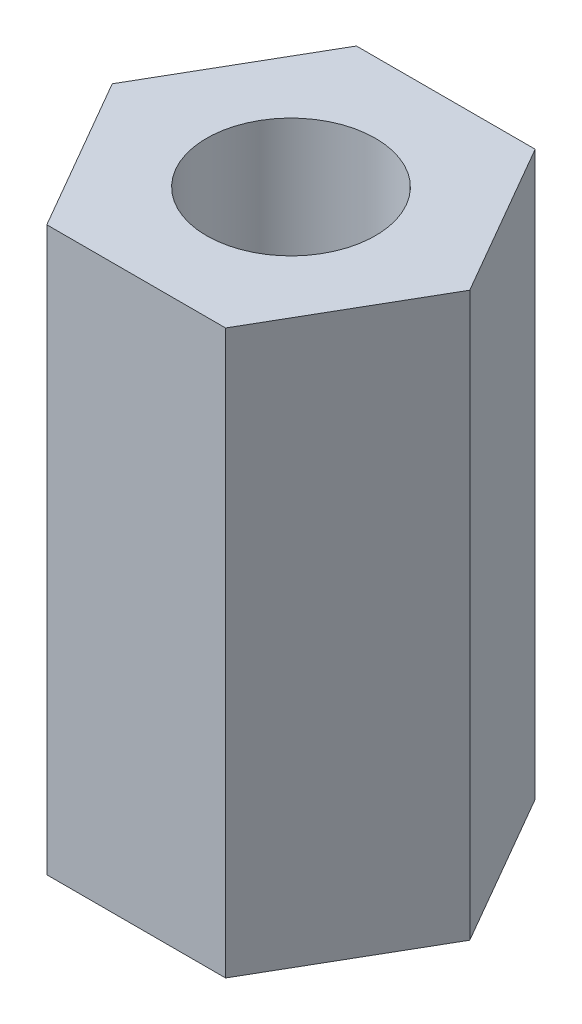
ISO-10303-21;
HEADER;
FILE_DESCRIPTION(('STEP AP214'),'2;1');
FILE_NAME('part.step','',(''),(''),'','','');
FILE_SCHEMA(('AUTOMOTIVE_DESIGN { 1 0 10303 214 1 1 1 1 }'));
ENDSEC;
DATA;
#1=APPLICATION_CONTEXT('core data for automotive mechanical design processes');
#2=APPLICATION_PROTOCOL_DEFINITION('international standard','automotive_design',2000,#1);
#3=PRODUCT_CONTEXT('',#1,'mechanical');
#4=PRODUCT('Part','Part','',(#3));
#5=PRODUCT_RELATED_PRODUCT_CATEGORY('part','',(#4));
#6=PRODUCT_DEFINITION_FORMATION('','',#4);
#7=PRODUCT_DEFINITION_CONTEXT('part definition',#1,'design');
#8=PRODUCT_DEFINITION('design','',#6,#7);
#9=PRODUCT_DEFINITION_SHAPE('','',#8);
#10=(LENGTH_UNIT() NAMED_UNIT(*) SI_UNIT(.MILLI.,.METRE.));
#11=(NAMED_UNIT(*) PLANE_ANGLE_UNIT() SI_UNIT($,.RADIAN.));
#12=(NAMED_UNIT(*) SI_UNIT($,.STERADIAN.) SOLID_ANGLE_UNIT());
#13=UNCERTAINTY_MEASURE_WITH_UNIT(LENGTH_MEASURE(1.E-05),#10,'distance_accuracy_value','');
#14=(GEOMETRIC_REPRESENTATION_CONTEXT(3) GLOBAL_UNCERTAINTY_ASSIGNED_CONTEXT((#13)) GLOBAL_UNIT_ASSIGNED_CONTEXT((#10,
#11,#12)) REPRESENTATION_CONTEXT('',''));
#15=CARTESIAN_POINT('',(0.,0.,0.));
#16=DIRECTION('',(0.,0.,1.));
#17=DIRECTION('',(1.,0.,0.));
#18=AXIS2_PLACEMENT_3D('',#15,#16,#17);
#19=CARTESIAN_POINT('',(0.,10.,0.));
#20=DIRECTION('',(0.,1.,0.));
#21=DIRECTION('',(0.,0.,1.));
#22=AXIS2_PLACEMENT_3D('',#19,#20,#21);
#23=PLANE('',#22);
#24=DIRECTION('',(0.499999999999995,0.,-0.866025403784441));
#25=VECTOR('',#24,1.);
#26=CARTESIAN_POINT('',(1.5877132402715,10.,2.74999999999997));
#27=LINE('',#26,#25);
#28=CARTESIAN_POINT('',(1.5877132402715,10.,2.74999999999997));
#29=VERTEX_POINT('',#28);
#30=CARTESIAN_POINT('',(3.17542648054293,10.,0.));
#31=VERTEX_POINT('',#30);
#32=EDGE_CURVE('E146',#29,#31,#27,.T.);
#33=ORIENTED_EDGE('',*,*,#32,.T.);
#34=DIRECTION('',(-0.500000000000001,0.,-0.866025403784438));
#35=VECTOR('',#34,1.);
#36=CARTESIAN_POINT('',(3.17542648054293,10.,0.));
#37=LINE('',#36,#35);
#38=CARTESIAN_POINT('',(1.58771324027146,10.,-2.74999999999999));
#39=VERTEX_POINT('',#38);
#40=EDGE_CURVE('E94',#31,#39,#37,.T.);
#41=ORIENTED_EDGE('',*,*,#40,.T.);
#42=DIRECTION('',(-1.,0.,0.));
#43=VECTOR('',#42,1.);
#44=CARTESIAN_POINT('',(1.58771324027146,10.,-2.74999999999999));
#45=LINE('',#44,#43);
#46=CARTESIAN_POINT('',(-1.58771324027148,10.,-2.74999999999998));
#47=VERTEX_POINT('',#46);
#48=EDGE_CURVE('E107',#39,#47,#45,.T.);
#49=ORIENTED_EDGE('',*,*,#48,.T.);
#50=DIRECTION('',(-0.499999999999995,0.,0.866025403784442));
#51=VECTOR('',#50,1.);
#52=CARTESIAN_POINT('',(-1.58771324027148,10.,-2.74999999999998));
#53=LINE('',#52,#51);
#54=CARTESIAN_POINT('',(-3.17542648054293,10.,0.));
#55=VERTEX_POINT('',#54);
#56=EDGE_CURVE('E101',#47,#55,#53,.T.);
#57=ORIENTED_EDGE('',*,*,#56,.T.);
#58=DIRECTION('',(0.500000000000007,0.,0.866025403784435));
#59=VECTOR('',#58,1.);
#60=CARTESIAN_POINT('',(-3.17542648054293,10.,0.));
#61=LINE('',#60,#59);
#62=CARTESIAN_POINT('',(-1.58771324027144,10.,2.75));
#63=VERTEX_POINT('',#62);
#64=EDGE_CURVE('E105',#55,#63,#61,.T.);
#65=ORIENTED_EDGE('',*,*,#64,.T.);
#66=DIRECTION('',(1.,0.,0.));
#67=VECTOR('',#66,1.);
#68=CARTESIAN_POINT('',(-1.58771324027144,10.,2.75));
#69=LINE('',#68,#67);
#70=EDGE_CURVE('E57',#63,#29,#69,.T.);
#71=ORIENTED_EDGE('',*,*,#70,.T.);
#72=EDGE_LOOP('',(#33,#41,#49,#57,#65,#71));
#73=FACE_BOUND('',#72,.T.);
#74=CARTESIAN_POINT('',(0.,10.,0.));
#75=DIRECTION('',(0.,1.,0.));
#76=DIRECTION('',(0.,0.,1.));
#77=AXIS2_PLACEMENT_3D('',#74,#75,#76);
#78=CIRCLE('',#77,1.5);
#79=CARTESIAN_POINT('',(0.,10.,1.5));
#80=VERTEX_POINT('',#79);
#81=EDGE_CURVE('E134',#80,#80,#78,.T.);
#82=ORIENTED_EDGE('',*,*,#81,.F.);
#83=EDGE_LOOP('',(#82));
#84=FACE_BOUND('',#83,.T.);
#85=ADVANCED_FACE('F39',(#73,#84),#23,.T.);
#86=CARTESIAN_POINT('',(0.,0.,0.));
#87=DIRECTION('',(0.,1.,0.));
#88=DIRECTION('',(0.,0.,1.));
#89=AXIS2_PLACEMENT_3D('',#86,#87,#88);
#90=PLANE('',#89);
#91=DIRECTION('',(0.499999999999995,0.,-0.866025403784441));
#92=VECTOR('',#91,1.);
#93=CARTESIAN_POINT('',(1.5877132402715,0.,2.74999999999997));
#94=LINE('',#93,#92);
#95=CARTESIAN_POINT('',(1.5877132402715,0.,2.74999999999997));
#96=VERTEX_POINT('',#95);
#97=CARTESIAN_POINT('',(3.17542648054293,0.,0.));
#98=VERTEX_POINT('',#97);
#99=EDGE_CURVE('E129',#96,#98,#94,.T.);
#100=ORIENTED_EDGE('',*,*,#99,.F.);
#101=DIRECTION('',(1.,0.,0.));
#102=VECTOR('',#101,1.);
#103=CARTESIAN_POINT('',(-1.58771324027144,0.,2.75));
#104=LINE('',#103,#102);
#105=CARTESIAN_POINT('',(-1.58771324027144,0.,2.75));
#106=VERTEX_POINT('',#105);
#107=EDGE_CURVE('E86',#106,#96,#104,.T.);
#108=ORIENTED_EDGE('',*,*,#107,.F.);
#109=DIRECTION('',(0.500000000000007,0.,0.866025403784435));
#110=VECTOR('',#109,1.);
#111=CARTESIAN_POINT('',(-3.17542648054293,0.,0.));
#112=LINE('',#111,#110);
#113=CARTESIAN_POINT('',(-3.17542648054293,0.,0.));
#114=VERTEX_POINT('',#113);
#115=EDGE_CURVE('E80',#114,#106,#112,.T.);
#116=ORIENTED_EDGE('',*,*,#115,.F.);
#117=DIRECTION('',(-0.499999999999995,0.,0.866025403784442));
#118=VECTOR('',#117,1.);
#119=CARTESIAN_POINT('',(-1.58771324027148,0.,-2.74999999999998));
#120=LINE('',#119,#118);
#121=CARTESIAN_POINT('',(-1.58771324027148,0.,-2.74999999999998));
#122=VERTEX_POINT('',#121);
#123=EDGE_CURVE('E116',#122,#114,#120,.T.);
#124=ORIENTED_EDGE('',*,*,#123,.F.);
#125=DIRECTION('',(-1.,0.,0.));
#126=VECTOR('',#125,1.);
#127=CARTESIAN_POINT('',(1.58771324027146,0.,-2.74999999999999));
#128=LINE('',#127,#126);
#129=CARTESIAN_POINT('',(1.58771324027146,0.,-2.74999999999999));
#130=VERTEX_POINT('',#129);
#131=EDGE_CURVE('E137',#130,#122,#128,.T.);
#132=ORIENTED_EDGE('',*,*,#131,.F.);
#133=DIRECTION('',(-0.500000000000001,0.,-0.866025403784438));
#134=VECTOR('',#133,1.);
#135=CARTESIAN_POINT('',(3.17542648054293,0.,0.));
#136=LINE('',#135,#134);
#137=EDGE_CURVE('E133',#98,#130,#136,.T.);
#138=ORIENTED_EDGE('',*,*,#137,.F.);
#139=EDGE_LOOP('',(#100,#108,#116,#124,#132,#138));
#140=FACE_BOUND('',#139,.T.);
#141=CARTESIAN_POINT('',(0.,0.,0.));
#142=DIRECTION('',(0.,1.,0.));
#143=DIRECTION('',(0.,0.,1.));
#144=AXIS2_PLACEMENT_3D('',#141,#142,#143);
#145=CIRCLE('',#144,1.5);
#146=CARTESIAN_POINT('',(0.,0.,1.5));
#147=VERTEX_POINT('',#146);
#148=EDGE_CURVE('E243',#147,#147,#145,.T.);
#149=ORIENTED_EDGE('',*,*,#148,.T.);
#150=EDGE_LOOP('',(#149));
#151=FACE_BOUND('',#150,.T.);
#152=ADVANCED_FACE('F159',(#140,#151),#90,.F.);
#153=CARTESIAN_POINT('',(1.5877132402715,10.,2.74999999999997));
#154=DIRECTION('',(-0.866025403784442,0.,-0.499999999999995));
#155=DIRECTION('',(-0.499999999999995,0.,0.866025403784442));
#156=AXIS2_PLACEMENT_3D('',#153,#154,#155);
#157=PLANE('',#156);
#158=ORIENTED_EDGE('',*,*,#99,.T.);
#159=DIRECTION('',(0.,-1.,0.));
#160=VECTOR('',#159,1.);
#161=CARTESIAN_POINT('',(3.17542648054293,10.,0.));
#162=LINE('',#161,#160);
#163=EDGE_CURVE('E11',#31,#98,#162,.T.);
#164=ORIENTED_EDGE('',*,*,#163,.F.);
#165=ORIENTED_EDGE('',*,*,#32,.F.);
#166=DIRECTION('',(0.,-1.,0.));
#167=VECTOR('',#166,1.);
#168=CARTESIAN_POINT('',(1.5877132402715,10.,2.74999999999997));
#169=LINE('',#168,#167);
#170=EDGE_CURVE('E125',#29,#96,#169,.T.);
#171=ORIENTED_EDGE('',*,*,#170,.T.);
#172=EDGE_LOOP('',(#158,#164,#165,#171));
#173=FACE_BOUND('',#172,.T.);
#174=ADVANCED_FACE('F41',(#173),#157,.F.);
#175=CARTESIAN_POINT('',(3.17542648054293,10.,0.));
#176=DIRECTION('',(-0.866025403784438,0.,0.500000000000001));
#177=DIRECTION('',(0.500000000000001,0.,0.866025403784438));
#178=AXIS2_PLACEMENT_3D('',#175,#176,#177);
#179=PLANE('',#178);
#180=ORIENTED_EDGE('',*,*,#137,.T.);
#181=DIRECTION('',(0.,-1.,0.));
#182=VECTOR('',#181,1.);
#183=CARTESIAN_POINT('',(1.58771324027146,10.,-2.74999999999999));
#184=LINE('',#183,#182);
#185=EDGE_CURVE('E49',#39,#130,#184,.T.);
#186=ORIENTED_EDGE('',*,*,#185,.F.);
#187=ORIENTED_EDGE('',*,*,#40,.F.);
#188=ORIENTED_EDGE('',*,*,#163,.T.);
#189=EDGE_LOOP('',(#180,#186,#187,#188));
#190=FACE_BOUND('',#189,.T.);
#191=ADVANCED_FACE('F184',(#190),#179,.F.);
#192=CARTESIAN_POINT('',(1.58771324027146,10.,-2.74999999999999));
#193=DIRECTION('',(0.,0.,1.));
#194=DIRECTION('',(1.,0.,0.));
#195=AXIS2_PLACEMENT_3D('',#192,#193,#194);
#196=PLANE('',#195);
#197=ORIENTED_EDGE('',*,*,#131,.T.);
#198=DIRECTION('',(0.,-1.,0.));
#199=VECTOR('',#198,1.);
#200=CARTESIAN_POINT('',(-1.58771324027148,10.,-2.74999999999998));
#201=LINE('',#200,#199);
#202=EDGE_CURVE('E118',#47,#122,#201,.T.);
#203=ORIENTED_EDGE('',*,*,#202,.F.);
#204=ORIENTED_EDGE('',*,*,#48,.F.);
#205=ORIENTED_EDGE('',*,*,#185,.T.);
#206=EDGE_LOOP('',(#197,#203,#204,#205));
#207=FACE_BOUND('',#206,.T.);
#208=ADVANCED_FACE('F156',(#207),#196,.F.);
#209=CARTESIAN_POINT('',(-1.58771324027148,10.,-2.74999999999998));
#210=DIRECTION('',(0.866025403784442,0.,0.499999999999995));
#211=DIRECTION('',(0.499999999999995,0.,-0.866025403784442));
#212=AXIS2_PLACEMENT_3D('',#209,#210,#211);
#213=PLANE('',#212);
#214=ORIENTED_EDGE('',*,*,#123,.T.);
#215=DIRECTION('',(0.,-1.,0.));
#216=VECTOR('',#215,1.);
#217=CARTESIAN_POINT('',(-3.17542648054293,10.,0.));
#218=LINE('',#217,#216);
#219=EDGE_CURVE('E113',#55,#114,#218,.T.);
#220=ORIENTED_EDGE('',*,*,#219,.F.);
#221=ORIENTED_EDGE('',*,*,#56,.F.);
#222=ORIENTED_EDGE('',*,*,#202,.T.);
#223=EDGE_LOOP('',(#214,#220,#221,#222));
#224=FACE_BOUND('',#223,.T.);
#225=ADVANCED_FACE('F114',(#224),#213,.F.);
#226=CARTESIAN_POINT('',(-3.17542648054293,10.,0.));
#227=DIRECTION('',(0.866025403784435,0.,-0.500000000000007));
#228=DIRECTION('',(-0.500000000000007,0.,-0.866025403784435));
#229=AXIS2_PLACEMENT_3D('',#226,#227,#228);
#230=PLANE('',#229);
#231=ORIENTED_EDGE('',*,*,#115,.T.);
#232=DIRECTION('',(0.,-1.,0.));
#233=VECTOR('',#232,1.);
#234=CARTESIAN_POINT('',(-1.58771324027144,10.,2.75));
#235=LINE('',#234,#233);
#236=EDGE_CURVE('E119',#63,#106,#235,.T.);
#237=ORIENTED_EDGE('',*,*,#236,.F.);
#238=ORIENTED_EDGE('',*,*,#64,.F.);
#239=ORIENTED_EDGE('',*,*,#219,.T.);
#240=EDGE_LOOP('',(#231,#237,#238,#239));
#241=FACE_BOUND('',#240,.T.);
#242=ADVANCED_FACE('F121',(#241),#230,.F.);
#243=CARTESIAN_POINT('',(-1.58771324027144,10.,2.75));
#244=DIRECTION('',(0.,0.,-1.));
#245=DIRECTION('',(-1.,0.,0.));
#246=AXIS2_PLACEMENT_3D('',#243,#244,#245);
#247=PLANE('',#246);
#248=ORIENTED_EDGE('',*,*,#107,.T.);
#249=ORIENTED_EDGE('',*,*,#170,.F.);
#250=ORIENTED_EDGE('',*,*,#70,.F.);
#251=ORIENTED_EDGE('',*,*,#236,.T.);
#252=EDGE_LOOP('',(#248,#249,#250,#251));
#253=FACE_BOUND('',#252,.T.);
#254=ADVANCED_FACE('F164',(#253),#247,.F.);
#255=CARTESIAN_POINT('',(0.,10.,0.));
#256=DIRECTION('',(0.,-1.,0.));
#257=DIRECTION('',(0.,0.,-1.));
#258=AXIS2_PLACEMENT_3D('',#255,#256,#257);
#259=CYLINDRICAL_SURFACE('',#258,1.5);
#260=ORIENTED_EDGE('',*,*,#81,.T.);
#261=EDGE_LOOP('',(#260));
#262=FACE_BOUND('',#261,.T.);
#263=ORIENTED_EDGE('',*,*,#148,.F.);
#264=EDGE_LOOP('',(#263));
#265=FACE_BOUND('',#264,.T.);
#266=ADVANCED_FACE('F166',(#262,#265),#259,.F.);
#267=CLOSED_SHELL('',(#85,#152,#174,#191,#208,#225,#242,#254,#266));
#268=MANIFOLD_SOLID_BREP('B2',#267);
#269=ADVANCED_BREP_SHAPE_REPRESENTATION('',(#18,#268),#14);
#270=SHAPE_DEFINITION_REPRESENTATION(#9,#269);
ENDSEC;
END-ISO-10303-21;
